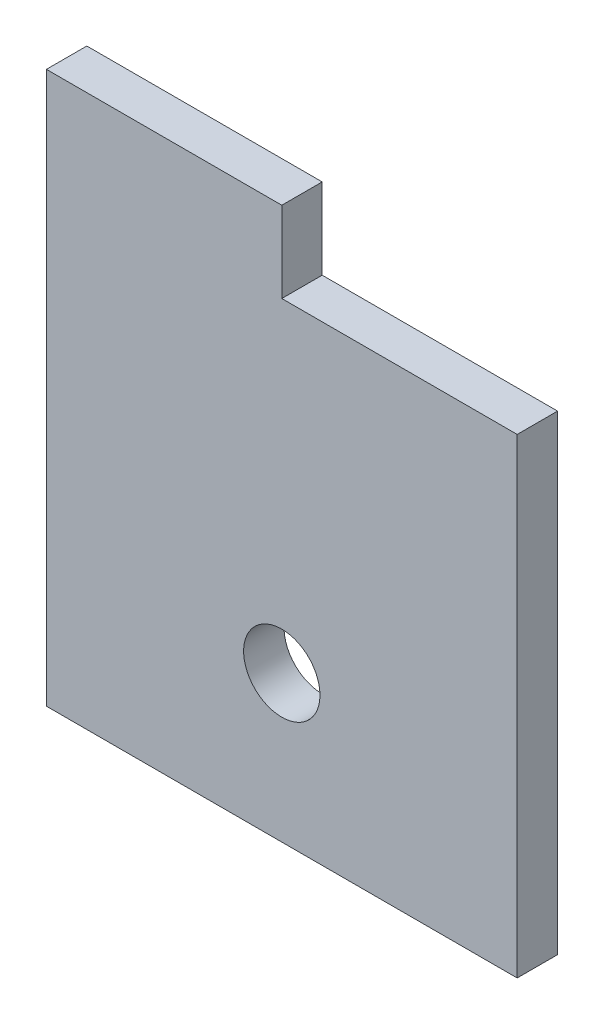
ISO-10303-21;
HEADER;
FILE_DESCRIPTION(('STEP AP214'),'2;1');
FILE_NAME('part.step','',(''),(''),'','','');
FILE_SCHEMA(('AUTOMOTIVE_DESIGN { 1 0 10303 214 1 1 1 1 }'));
ENDSEC;
DATA;
#1=APPLICATION_CONTEXT('core data for automotive mechanical design processes');
#2=APPLICATION_PROTOCOL_DEFINITION('international standard','automotive_design',2000,#1);
#3=PRODUCT_CONTEXT('',#1,'mechanical');
#4=PRODUCT('Part','Part','',(#3));
#5=PRODUCT_RELATED_PRODUCT_CATEGORY('part','',(#4));
#6=PRODUCT_DEFINITION_FORMATION('','',#4);
#7=PRODUCT_DEFINITION_CONTEXT('part definition',#1,'design');
#8=PRODUCT_DEFINITION('design','',#6,#7);
#9=PRODUCT_DEFINITION_SHAPE('','',#8);
#10=(LENGTH_UNIT() NAMED_UNIT(*) SI_UNIT(.MILLI.,.METRE.));
#11=(NAMED_UNIT(*) PLANE_ANGLE_UNIT() SI_UNIT($,.RADIAN.));
#12=(NAMED_UNIT(*) SI_UNIT($,.STERADIAN.) SOLID_ANGLE_UNIT());
#13=UNCERTAINTY_MEASURE_WITH_UNIT(LENGTH_MEASURE(1.E-05),#10,'distance_accuracy_value','');
#14=(GEOMETRIC_REPRESENTATION_CONTEXT(3) GLOBAL_UNCERTAINTY_ASSIGNED_CONTEXT((#13)) GLOBAL_UNIT_ASSIGNED_CONTEXT((#10,
#11,#12)) REPRESENTATION_CONTEXT('',''));
#15=CARTESIAN_POINT('',(0.,0.,0.));
#16=DIRECTION('',(0.,0.,1.));
#17=DIRECTION('',(1.,0.,0.));
#18=AXIS2_PLACEMENT_3D('',#15,#16,#17);
#19=CARTESIAN_POINT('',(0.,0.,3.175));
#20=DIRECTION('',(0.,0.,-1.));
#21=DIRECTION('',(-1.,0.,0.));
#22=AXIS2_PLACEMENT_3D('',#19,#20,#21);
#23=PLANE('',#22);
#24=DIRECTION('',(1.,0.,0.));
#25=VECTOR('',#24,1.);
#26=CARTESIAN_POINT('',(18.5,0.,3.175));
#27=LINE('',#26,#25);
#28=CARTESIAN_POINT('',(0.,0.,3.175));
#29=VERTEX_POINT('',#28);
#30=CARTESIAN_POINT('',(37.,0.,3.175));
#31=VERTEX_POINT('',#30);
#32=EDGE_CURVE('E82',#29,#31,#27,.T.);
#33=ORIENTED_EDGE('',*,*,#32,.T.);
#34=DIRECTION('',(0.,1.,0.));
#35=VECTOR('',#34,1.);
#36=CARTESIAN_POINT('',(37.,0.,3.175));
#37=LINE('',#36,#35);
#38=CARTESIAN_POINT('',(37.,37.,3.175));
#39=VERTEX_POINT('',#38);
#40=EDGE_CURVE('E143',#31,#39,#37,.T.);
#41=ORIENTED_EDGE('',*,*,#40,.T.);
#42=DIRECTION('',(-1.,0.,0.));
#43=VECTOR('',#42,1.);
#44=CARTESIAN_POINT('',(18.5,37.,3.175));
#45=LINE('',#44,#43);
#46=CARTESIAN_POINT('',(18.5,37.,3.175));
#47=VERTEX_POINT('',#46);
#48=EDGE_CURVE('E97',#39,#47,#45,.T.);
#49=ORIENTED_EDGE('',*,*,#48,.T.);
#50=DIRECTION('',(0.,1.,0.));
#51=VECTOR('',#50,1.);
#52=CARTESIAN_POINT('',(18.5,37.,3.175));
#53=LINE('',#52,#51);
#54=CARTESIAN_POINT('',(18.4999999999999,43.35,3.175));
#55=VERTEX_POINT('',#54);
#56=EDGE_CURVE('E90',#47,#55,#53,.T.);
#57=ORIENTED_EDGE('',*,*,#56,.T.);
#58=DIRECTION('',(-1.,0.,0.));
#59=VECTOR('',#58,1.);
#60=CARTESIAN_POINT('',(18.4999999999999,43.35,3.175));
#61=LINE('',#60,#59);
#62=CARTESIAN_POINT('',(0.,43.35,3.175));
#63=VERTEX_POINT('',#62);
#64=EDGE_CURVE('E94',#55,#63,#61,.T.);
#65=ORIENTED_EDGE('',*,*,#64,.T.);
#66=DIRECTION('',(0.,-1.,0.));
#67=VECTOR('',#66,1.);
#68=CARTESIAN_POINT('',(0.,43.35,3.175));
#69=LINE('',#68,#67);
#70=EDGE_CURVE('E50',#63,#29,#69,.T.);
#71=ORIENTED_EDGE('',*,*,#70,.T.);
#72=EDGE_LOOP('',(#33,#41,#49,#57,#65,#71));
#73=FACE_BOUND('',#72,.T.);
#74=CARTESIAN_POINT('',(18.4999999999999,11.5000000000001,3.175));
#75=DIRECTION('',(0.,0.,1.));
#76=DIRECTION('',(1.,0.,0.));
#77=AXIS2_PLACEMENT_3D('',#74,#75,#76);
#78=CIRCLE('',#77,3.);
#79=CARTESIAN_POINT('',(21.4999999999999,11.5000000000001,3.175));
#80=VERTEX_POINT('',#79);
#81=EDGE_CURVE('E120',#80,#80,#78,.T.);
#82=ORIENTED_EDGE('',*,*,#81,.F.);
#83=EDGE_LOOP('',(#82));
#84=FACE_BOUND('',#83,.T.);
#85=ADVANCED_FACE('F33',(#73,#84),#23,.F.);
#86=CARTESIAN_POINT('',(0.,0.,0.));
#87=DIRECTION('',(0.,0.,-1.));
#88=DIRECTION('',(-1.,0.,0.));
#89=AXIS2_PLACEMENT_3D('',#86,#87,#88);
#90=PLANE('',#89);
#91=DIRECTION('',(1.,0.,0.));
#92=VECTOR('',#91,1.);
#93=CARTESIAN_POINT('',(18.5,0.,0.));
#94=LINE('',#93,#92);
#95=CARTESIAN_POINT('',(0.,0.,0.));
#96=VERTEX_POINT('',#95);
#97=CARTESIAN_POINT('',(37.,0.,0.));
#98=VERTEX_POINT('',#97);
#99=EDGE_CURVE('E77',#96,#98,#94,.T.);
#100=ORIENTED_EDGE('',*,*,#99,.F.);
#101=DIRECTION('',(0.,-1.,0.));
#102=VECTOR('',#101,1.);
#103=CARTESIAN_POINT('',(0.,0.,0.));
#104=LINE('',#103,#102);
#105=CARTESIAN_POINT('',(0.,43.35,0.));
#106=VERTEX_POINT('',#105);
#107=EDGE_CURVE('E73',#106,#96,#104,.T.);
#108=ORIENTED_EDGE('',*,*,#107,.F.);
#109=DIRECTION('',(-1.,0.,0.));
#110=VECTOR('',#109,1.);
#111=CARTESIAN_POINT('',(18.4999999999999,43.35,0.));
#112=LINE('',#111,#110);
#113=CARTESIAN_POINT('',(18.4999999999999,43.35,0.));
#114=VERTEX_POINT('',#113);
#115=EDGE_CURVE('E125',#114,#106,#112,.T.);
#116=ORIENTED_EDGE('',*,*,#115,.F.);
#117=DIRECTION('',(0.,1.,0.));
#118=VECTOR('',#117,1.);
#119=CARTESIAN_POINT('',(18.5,37.,0.));
#120=LINE('',#119,#118);
#121=CARTESIAN_POINT('',(18.5,37.,0.));
#122=VERTEX_POINT('',#121);
#123=EDGE_CURVE('E106',#122,#114,#120,.T.);
#124=ORIENTED_EDGE('',*,*,#123,.F.);
#125=DIRECTION('',(-1.,0.,0.));
#126=VECTOR('',#125,1.);
#127=CARTESIAN_POINT('',(18.5,37.,0.));
#128=LINE('',#127,#126);
#129=CARTESIAN_POINT('',(37.,37.,0.));
#130=VERTEX_POINT('',#129);
#131=EDGE_CURVE('E122',#130,#122,#128,.T.);
#132=ORIENTED_EDGE('',*,*,#131,.F.);
#133=DIRECTION('',(0.,1.,0.));
#134=VECTOR('',#133,1.);
#135=CARTESIAN_POINT('',(37.,0.,0.));
#136=LINE('',#135,#134);
#137=EDGE_CURVE('E119',#98,#130,#136,.T.);
#138=ORIENTED_EDGE('',*,*,#137,.F.);
#139=EDGE_LOOP('',(#100,#108,#116,#124,#132,#138));
#140=FACE_BOUND('',#139,.T.);
#141=CARTESIAN_POINT('',(18.4999999999999,11.5000000000001,0.));
#142=DIRECTION('',(0.,0.,1.));
#143=DIRECTION('',(1.,0.,0.));
#144=AXIS2_PLACEMENT_3D('',#141,#142,#143);
#145=CIRCLE('',#144,3.);
#146=CARTESIAN_POINT('',(21.4999999999999,11.5000000000001,0.));
#147=VERTEX_POINT('',#146);
#148=EDGE_CURVE('E147',#147,#147,#145,.T.);
#149=ORIENTED_EDGE('',*,*,#148,.T.);
#150=EDGE_LOOP('',(#149));
#151=FACE_BOUND('',#150,.T.);
#152=ADVANCED_FACE('F138',(#140,#151),#90,.T.);
#153=CARTESIAN_POINT('',(18.5,0.,3.175));
#154=DIRECTION('',(0.,1.,0.));
#155=DIRECTION('',(-1.,0.,0.));
#156=AXIS2_PLACEMENT_3D('',#153,#154,#155);
#157=PLANE('',#156);
#158=ORIENTED_EDGE('',*,*,#99,.T.);
#159=DIRECTION('',(0.,0.,-1.));
#160=VECTOR('',#159,1.);
#161=CARTESIAN_POINT('',(37.,0.,3.175));
#162=LINE('',#161,#160);
#163=EDGE_CURVE('E11',#31,#98,#162,.T.);
#164=ORIENTED_EDGE('',*,*,#163,.F.);
#165=ORIENTED_EDGE('',*,*,#32,.F.);
#166=DIRECTION('',(0.,0.,-1.));
#167=VECTOR('',#166,1.);
#168=CARTESIAN_POINT('',(0.,0.,3.175));
#169=LINE('',#168,#167);
#170=EDGE_CURVE('E114',#29,#96,#169,.T.);
#171=ORIENTED_EDGE('',*,*,#170,.T.);
#172=EDGE_LOOP('',(#158,#164,#165,#171));
#173=FACE_BOUND('',#172,.T.);
#174=ADVANCED_FACE('F35',(#173),#157,.F.);
#175=CARTESIAN_POINT('',(37.,0.,3.175));
#176=DIRECTION('',(-1.,0.,0.));
#177=DIRECTION('',(0.,0.,1.));
#178=AXIS2_PLACEMENT_3D('',#175,#176,#177);
#179=PLANE('',#178);
#180=ORIENTED_EDGE('',*,*,#137,.T.);
#181=DIRECTION('',(0.,0.,-1.));
#182=VECTOR('',#181,1.);
#183=CARTESIAN_POINT('',(37.,37.,3.175));
#184=LINE('',#183,#182);
#185=EDGE_CURVE('E42',#39,#130,#184,.T.);
#186=ORIENTED_EDGE('',*,*,#185,.F.);
#187=ORIENTED_EDGE('',*,*,#40,.F.);
#188=ORIENTED_EDGE('',*,*,#163,.T.);
#189=EDGE_LOOP('',(#180,#186,#187,#188));
#190=FACE_BOUND('',#189,.T.);
#191=ADVANCED_FACE('F170',(#190),#179,.F.);
#192=CARTESIAN_POINT('',(18.5,37.,3.175));
#193=DIRECTION('',(0.,-1.,0.));
#194=DIRECTION('',(0.,0.,-1.));
#195=AXIS2_PLACEMENT_3D('',#192,#193,#194);
#196=PLANE('',#195);
#197=ORIENTED_EDGE('',*,*,#131,.T.);
#198=DIRECTION('',(0.,0.,-1.));
#199=VECTOR('',#198,1.);
#200=CARTESIAN_POINT('',(18.5,37.,3.175));
#201=LINE('',#200,#199);
#202=EDGE_CURVE('E108',#47,#122,#201,.T.);
#203=ORIENTED_EDGE('',*,*,#202,.F.);
#204=ORIENTED_EDGE('',*,*,#48,.F.);
#205=ORIENTED_EDGE('',*,*,#185,.T.);
#206=EDGE_LOOP('',(#197,#203,#204,#205));
#207=FACE_BOUND('',#206,.T.);
#208=ADVANCED_FACE('F135',(#207),#196,.F.);
#209=CARTESIAN_POINT('',(18.5,37.,3.175));
#210=DIRECTION('',(-1.,0.,0.));
#211=DIRECTION('',(0.,-1.,0.));
#212=AXIS2_PLACEMENT_3D('',#209,#210,#211);
#213=PLANE('',#212);
#214=ORIENTED_EDGE('',*,*,#123,.T.);
#215=DIRECTION('',(0.,0.,-1.));
#216=VECTOR('',#215,1.);
#217=CARTESIAN_POINT('',(18.4999999999999,43.35,3.175));
#218=LINE('',#217,#216);
#219=EDGE_CURVE('E103',#55,#114,#218,.T.);
#220=ORIENTED_EDGE('',*,*,#219,.F.);
#221=ORIENTED_EDGE('',*,*,#56,.F.);
#222=ORIENTED_EDGE('',*,*,#202,.T.);
#223=EDGE_LOOP('',(#214,#220,#221,#222));
#224=FACE_BOUND('',#223,.T.);
#225=ADVANCED_FACE('F104',(#224),#213,.F.);
#226=CARTESIAN_POINT('',(18.4999999999999,43.35,3.175));
#227=DIRECTION('',(0.,-1.,0.));
#228=DIRECTION('',(1.,0.,0.));
#229=AXIS2_PLACEMENT_3D('',#226,#227,#228);
#230=PLANE('',#229);
#231=ORIENTED_EDGE('',*,*,#115,.T.);
#232=DIRECTION('',(0.,0.,-1.));
#233=VECTOR('',#232,1.);
#234=CARTESIAN_POINT('',(0.,43.35,3.175));
#235=LINE('',#234,#233);
#236=EDGE_CURVE('E109',#63,#106,#235,.T.);
#237=ORIENTED_EDGE('',*,*,#236,.F.);
#238=ORIENTED_EDGE('',*,*,#64,.F.);
#239=ORIENTED_EDGE('',*,*,#219,.T.);
#240=EDGE_LOOP('',(#231,#237,#238,#239));
#241=FACE_BOUND('',#240,.T.);
#242=ADVANCED_FACE('F111',(#241),#230,.F.);
#243=CARTESIAN_POINT('',(0.,0.,3.175));
#244=DIRECTION('',(1.,0.,0.));
#245=DIRECTION('',(0.,0.,-1.));
#246=AXIS2_PLACEMENT_3D('',#243,#244,#245);
#247=PLANE('',#246);
#248=ORIENTED_EDGE('',*,*,#107,.T.);
#249=ORIENTED_EDGE('',*,*,#170,.F.);
#250=ORIENTED_EDGE('',*,*,#70,.F.);
#251=ORIENTED_EDGE('',*,*,#236,.T.);
#252=EDGE_LOOP('',(#248,#249,#250,#251));
#253=FACE_BOUND('',#252,.T.);
#254=ADVANCED_FACE('F141',(#253),#247,.F.);
#255=CARTESIAN_POINT('',(18.4999999999999,11.5000000000001,3.175));
#256=DIRECTION('',(0.,0.,-1.));
#257=DIRECTION('',(-1.,0.,0.));
#258=AXIS2_PLACEMENT_3D('',#255,#256,#257);
#259=CYLINDRICAL_SURFACE('',#258,3.);
#260=ORIENTED_EDGE('',*,*,#81,.T.);
#261=EDGE_LOOP('',(#260));
#262=FACE_BOUND('',#261,.T.);
#263=ORIENTED_EDGE('',*,*,#148,.F.);
#264=EDGE_LOOP('',(#263));
#265=FACE_BOUND('',#264,.T.);
#266=ADVANCED_FACE('F153',(#262,#265),#259,.F.);
#267=CLOSED_SHELL('',(#85,#152,#174,#191,#208,#225,#242,#254,#266));
#268=MANIFOLD_SOLID_BREP('B2',#267);
#269=ADVANCED_BREP_SHAPE_REPRESENTATION('',(#18,#268),#14);
#270=SHAPE_DEFINITION_REPRESENTATION(#9,#269);
ENDSEC;
END-ISO-10303-21;
